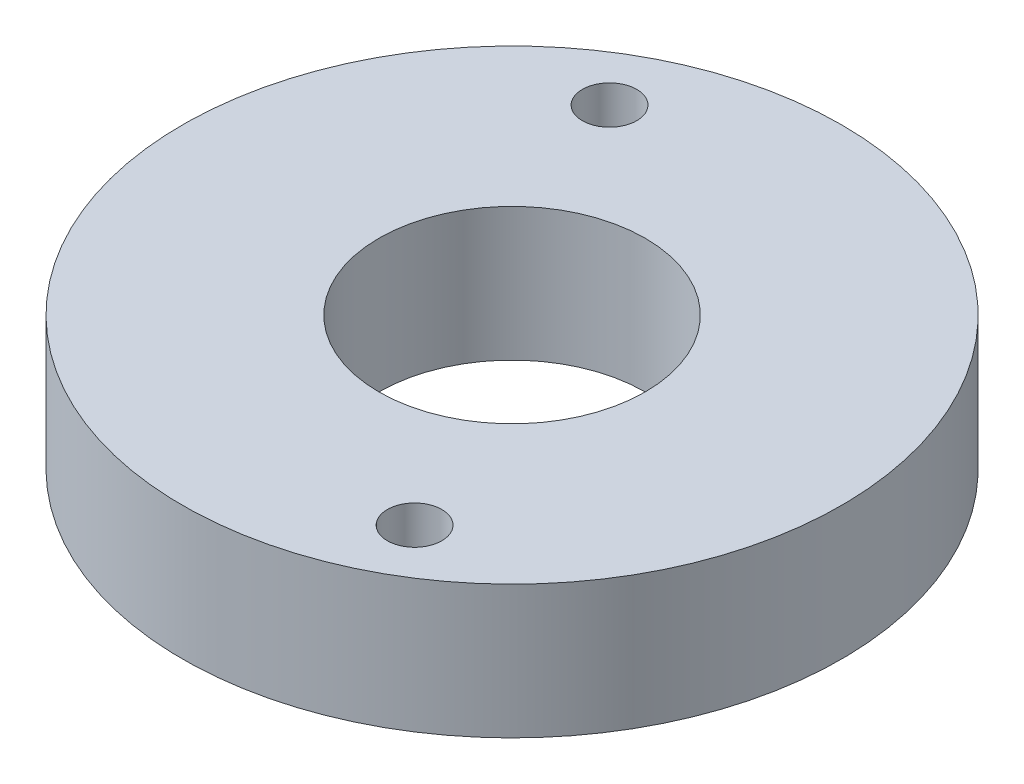
ISO-10303-21;
HEADER;
FILE_DESCRIPTION(('STEP AP214'),'2;1');
FILE_NAME('part.step','',(''),(''),'','','');
FILE_SCHEMA(('AUTOMOTIVE_DESIGN { 1 0 10303 214 1 1 1 1 }'));
ENDSEC;
DATA;
#1=APPLICATION_CONTEXT('core data for automotive mechanical design processes');
#2=APPLICATION_PROTOCOL_DEFINITION('international standard','automotive_design',2000,#1);
#3=PRODUCT_CONTEXT('',#1,'mechanical');
#4=PRODUCT('Part','Part','',(#3));
#5=PRODUCT_RELATED_PRODUCT_CATEGORY('part','',(#4));
#6=PRODUCT_DEFINITION_FORMATION('','',#4);
#7=PRODUCT_DEFINITION_CONTEXT('part definition',#1,'design');
#8=PRODUCT_DEFINITION('design','',#6,#7);
#9=PRODUCT_DEFINITION_SHAPE('','',#8);
#10=(LENGTH_UNIT() NAMED_UNIT(*) SI_UNIT(.MILLI.,.METRE.));
#11=(NAMED_UNIT(*) PLANE_ANGLE_UNIT() SI_UNIT($,.RADIAN.));
#12=(NAMED_UNIT(*) SI_UNIT($,.STERADIAN.) SOLID_ANGLE_UNIT());
#13=UNCERTAINTY_MEASURE_WITH_UNIT(LENGTH_MEASURE(1.E-05),#10,'distance_accuracy_value','');
#14=(GEOMETRIC_REPRESENTATION_CONTEXT(3) GLOBAL_UNCERTAINTY_ASSIGNED_CONTEXT((#13)) GLOBAL_UNIT_ASSIGNED_CONTEXT((#10,
#11,#12)) REPRESENTATION_CONTEXT('',''));
#15=CARTESIAN_POINT('',(0.,0.,0.));
#16=DIRECTION('',(0.,0.,1.));
#17=DIRECTION('',(1.,0.,0.));
#18=AXIS2_PLACEMENT_3D('',#15,#16,#17);
#19=CARTESIAN_POINT('',(15.24,0.,0.));
#20=CARTESIAN_POINT('',(26.4688604773883,6.79726570857821,0.));
#21=CARTESIAN_POINT('',(37.719,0.,0.));
#22=B_SPLINE_CURVE_WITH_KNOTS('',2,(#19,#20,#21),.UNSPECIFIED.,.F.,.F.,(3,3),(0.,1.),.UNSPECIFIED.);
#23=CARTESIAN_POINT('',(0.,0.,0.));
#24=DIRECTION('',(0.,-1.,0.));
#25=AXIS1_PLACEMENT('',#23,#24);
#26=SURFACE_OF_REVOLUTION('',#22,#25);
#27=CARTESIAN_POINT('',(0.,0.,0.));
#28=DIRECTION('',(0.,-1.,0.));
#29=DIRECTION('',(0.,0.,-1.));
#30=AXIS2_PLACEMENT_3D('',#27,#28,#29);
#31=CIRCLE('',#30,37.719);
#32=CARTESIAN_POINT('',(0.,0.,-37.719));
#33=VERTEX_POINT('',#32);
#34=EDGE_CURVE('E11',#33,#33,#31,.T.);
#35=ORIENTED_EDGE('',*,*,#34,.T.);
#36=EDGE_LOOP('',(#35));
#37=FACE_BOUND('',#36,.T.);
#38=CARTESIAN_POINT('',(0.,0.,0.));
#39=DIRECTION('',(0.,-1.,0.));
#40=DIRECTION('',(0.,0.,-1.));
#41=AXIS2_PLACEMENT_3D('',#38,#39,#40);
#42=CIRCLE('',#41,15.24);
#43=CARTESIAN_POINT('',(0.,0.,-15.24));
#44=VERTEX_POINT('',#43);
#45=EDGE_CURVE('E55',#44,#44,#42,.T.);
#46=ORIENTED_EDGE('',*,*,#45,.F.);
#47=EDGE_LOOP('',(#46));
#48=FACE_BOUND('',#47,.T.);
#49=ADVANCED_FACE('F40',(#37,#48),#26,.F.);
#50=CARTESIAN_POINT('',(0.,0.,0.));
#51=DIRECTION('',(0.,-1.,0.));
#52=DIRECTION('',(0.,0.,-1.));
#53=AXIS2_PLACEMENT_3D('',#50,#51,#52);
#54=CYLINDRICAL_SURFACE('',#53,37.719);
#55=CARTESIAN_POINT('',(0.,15.24,0.));
#56=DIRECTION('',(0.,-1.,0.));
#57=DIRECTION('',(0.,0.,-1.));
#58=AXIS2_PLACEMENT_3D('',#55,#56,#57);
#59=CIRCLE('',#58,37.719);
#60=CARTESIAN_POINT('',(0.,15.24,-37.719));
#61=VERTEX_POINT('',#60);
#62=EDGE_CURVE('E47',#61,#61,#59,.T.);
#63=ORIENTED_EDGE('',*,*,#62,.T.);
#64=EDGE_LOOP('',(#63));
#65=FACE_BOUND('',#64,.T.);
#66=ORIENTED_EDGE('',*,*,#34,.F.);
#67=EDGE_LOOP('',(#66));
#68=FACE_BOUND('',#67,.T.);
#69=ADVANCED_FACE('F86',(#65,#68),#54,.T.);
#70=CARTESIAN_POINT('',(37.719,15.24,0.));
#71=DIRECTION('',(0.,1.,0.));
#72=DIRECTION('',(0.,0.,1.));
#73=AXIS2_PLACEMENT_3D('',#70,#71,#72);
#74=PLANE('',#73);
#75=CARTESIAN_POINT('',(-15.2399999999998,15.24,-26.3964543073498));
#76=DIRECTION('',(0.,1.,0.));
#77=DIRECTION('',(0.,0.,1.));
#78=AXIS2_PLACEMENT_3D('',#75,#76,#77);
#79=CIRCLE('',#78,3.1115);
#80=CARTESIAN_POINT('',(-15.2399999999998,15.24,-23.2849543073498));
#81=VERTEX_POINT('',#80);
#82=EDGE_CURVE('E70',#81,#81,#79,.T.);
#83=ORIENTED_EDGE('',*,*,#82,.F.);
#84=EDGE_LOOP('',(#83));
#85=FACE_BOUND('',#84,.T.);
#86=CARTESIAN_POINT('',(15.2400000000002,15.24,26.3964543073496));
#87=DIRECTION('',(0.,1.,0.));
#88=DIRECTION('',(0.,0.,1.));
#89=AXIS2_PLACEMENT_3D('',#86,#87,#88);
#90=CIRCLE('',#89,3.1115);
#91=CARTESIAN_POINT('',(15.2400000000002,15.24,29.5079543073496));
#92=VERTEX_POINT('',#91);
#93=EDGE_CURVE('E64',#92,#92,#90,.T.);
#94=ORIENTED_EDGE('',*,*,#93,.F.);
#95=EDGE_LOOP('',(#94));
#96=FACE_BOUND('',#95,.T.);
#97=CARTESIAN_POINT('',(0.,15.24,0.));
#98=DIRECTION('',(0.,-1.,0.));
#99=DIRECTION('',(0.,0.,-1.));
#100=AXIS2_PLACEMENT_3D('',#97,#98,#99);
#101=CIRCLE('',#100,15.24);
#102=CARTESIAN_POINT('',(0.,15.24,-15.24));
#103=VERTEX_POINT('',#102);
#104=EDGE_CURVE('E51',#103,#103,#101,.T.);
#105=ORIENTED_EDGE('',*,*,#104,.T.);
#106=EDGE_LOOP('',(#105));
#107=FACE_BOUND('',#106,.T.);
#108=ORIENTED_EDGE('',*,*,#62,.F.);
#109=EDGE_LOOP('',(#108));
#110=FACE_BOUND('',#109,.T.);
#111=ADVANCED_FACE('F82',(#85,#96,#107,#110),#74,.T.);
#112=CARTESIAN_POINT('',(0.,0.,0.));
#113=DIRECTION('',(0.,-1.,0.));
#114=DIRECTION('',(0.,0.,-1.));
#115=AXIS2_PLACEMENT_3D('',#112,#113,#114);
#116=CYLINDRICAL_SURFACE('',#115,15.24);
#117=ORIENTED_EDGE('',*,*,#45,.T.);
#118=EDGE_LOOP('',(#117));
#119=FACE_BOUND('',#118,.T.);
#120=ORIENTED_EDGE('',*,*,#104,.F.);
#121=EDGE_LOOP('',(#120));
#122=FACE_BOUND('',#121,.T.);
#123=ADVANCED_FACE('F85',(#119,#122),#116,.F.);
#124=CARTESIAN_POINT('',(15.2400000000002,7.62,26.3964543073496));
#125=DIRECTION('',(0.,1.,0.));
#126=DIRECTION('',(0.,0.,1.));
#127=AXIS2_PLACEMENT_3D('',#124,#125,#126);
#128=CYLINDRICAL_SURFACE('',#127,3.1115);
#129=CARTESIAN_POINT('',(15.2400000000002,7.62,26.3964543073496));
#130=DIRECTION('',(0.,1.,0.));
#131=DIRECTION('',(0.,0.,1.));
#132=AXIS2_PLACEMENT_3D('',#129,#130,#131);
#133=CIRCLE('',#132,3.1115);
#134=CARTESIAN_POINT('',(15.2400000000002,7.62,29.5079543073496));
#135=VERTEX_POINT('',#134);
#136=EDGE_CURVE('E59',#135,#135,#133,.T.);
#137=CARTESIAN_POINT('',(15.2400000000002,7.62,29.5079543073496));
#138=CARTESIAN_POINT('',(15.2400000000002,7.699375,29.5079543073496));
#139=CARTESIAN_POINT('',(15.2400000000002,7.77875,29.5079543073496));
#140=CARTESIAN_POINT('',(15.2400000000002,7.9375,29.5079543073496));
#141=CARTESIAN_POINT('',(15.2400000000002,8.016875,29.5079543073496));
#142=CARTESIAN_POINT('',(15.2400000000002,8.175625,29.5079543073496));
#143=CARTESIAN_POINT('',(15.2400000000002,8.255,29.5079543073496));
#144=CARTESIAN_POINT('',(15.2400000000002,8.41375,29.5079543073496));
#145=CARTESIAN_POINT('',(15.2400000000002,8.493125,29.5079543073496));
#146=CARTESIAN_POINT('',(15.2400000000002,8.651875,29.5079543073496));
#147=CARTESIAN_POINT('',(15.2400000000002,8.73125,29.5079543073496));
#148=CARTESIAN_POINT('',(15.2400000000002,8.89,29.5079543073496));
#149=CARTESIAN_POINT('',(15.2400000000002,8.969375,29.5079543073496));
#150=CARTESIAN_POINT('',(15.2400000000002,9.128125,29.5079543073496));
#151=CARTESIAN_POINT('',(15.2400000000002,9.2075,29.5079543073496));
#152=CARTESIAN_POINT('',(15.2400000000002,9.36625,29.5079543073496));
#153=CARTESIAN_POINT('',(15.2400000000002,9.445625,29.5079543073496));
#154=CARTESIAN_POINT('',(15.2400000000002,9.604375,29.5079543073496));
#155=CARTESIAN_POINT('',(15.2400000000002,9.68375,29.5079543073496));
#156=CARTESIAN_POINT('',(15.2400000000002,9.8425,29.5079543073496));
#157=CARTESIAN_POINT('',(15.2400000000002,9.921875,29.5079543073496));
#158=CARTESIAN_POINT('',(15.2400000000002,10.080625,29.5079543073496));
#159=CARTESIAN_POINT('',(15.2400000000002,10.16,29.5079543073496));
#160=CARTESIAN_POINT('',(15.2400000000002,10.31875,29.5079543073496));
#161=CARTESIAN_POINT('',(15.2400000000002,10.398125,29.5079543073496));
#162=CARTESIAN_POINT('',(15.2400000000002,10.556875,29.5079543073496));
#163=CARTESIAN_POINT('',(15.2400000000002,10.63625,29.5079543073496));
#164=CARTESIAN_POINT('',(15.2400000000002,10.795,29.5079543073496));
#165=CARTESIAN_POINT('',(15.2400000000002,10.874375,29.5079543073496));
#166=CARTESIAN_POINT('',(15.2400000000002,11.033125,29.5079543073496));
#167=CARTESIAN_POINT('',(15.2400000000002,11.1125,29.5079543073496));
#168=CARTESIAN_POINT('',(15.2400000000002,11.27125,29.5079543073496));
#169=CARTESIAN_POINT('',(15.2400000000002,11.350625,29.5079543073496));
#170=CARTESIAN_POINT('',(15.2400000000002,11.509375,29.5079543073496));
#171=CARTESIAN_POINT('',(15.2400000000002,11.58875,29.5079543073496));
#172=CARTESIAN_POINT('',(15.2400000000002,11.7475,29.5079543073496));
#173=CARTESIAN_POINT('',(15.2400000000002,11.826875,29.5079543073496));
#174=CARTESIAN_POINT('',(15.2400000000002,11.985625,29.5079543073496));
#175=CARTESIAN_POINT('',(15.2400000000002,12.065,29.5079543073496));
#176=CARTESIAN_POINT('',(15.2400000000002,12.22375,29.5079543073496));
#177=CARTESIAN_POINT('',(15.2400000000002,12.303125,29.5079543073496));
#178=CARTESIAN_POINT('',(15.2400000000002,12.461875,29.5079543073496));
#179=CARTESIAN_POINT('',(15.2400000000002,12.54125,29.5079543073496));
#180=CARTESIAN_POINT('',(15.2400000000002,12.7,29.5079543073496));
#181=CARTESIAN_POINT('',(15.2400000000002,12.779375,29.5079543073496));
#182=CARTESIAN_POINT('',(15.2400000000002,12.938125,29.5079543073496));
#183=CARTESIAN_POINT('',(15.2400000000002,13.0175,29.5079543073496));
#184=CARTESIAN_POINT('',(15.2400000000002,13.17625,29.5079543073496));
#185=CARTESIAN_POINT('',(15.2400000000002,13.255625,29.5079543073496));
#186=CARTESIAN_POINT('',(15.2400000000002,13.414375,29.5079543073496));
#187=CARTESIAN_POINT('',(15.2400000000002,13.49375,29.5079543073496));
#188=CARTESIAN_POINT('',(15.2400000000002,13.6525,29.5079543073496));
#189=CARTESIAN_POINT('',(15.2400000000002,13.731875,29.5079543073496));
#190=CARTESIAN_POINT('',(15.2400000000002,13.890625,29.5079543073496));
#191=CARTESIAN_POINT('',(15.2400000000002,13.97,29.5079543073496));
#192=CARTESIAN_POINT('',(15.2400000000002,14.12875,29.5079543073496));
#193=CARTESIAN_POINT('',(15.2400000000002,14.208125,29.5079543073496));
#194=CARTESIAN_POINT('',(15.2400000000002,14.366875,29.5079543073496));
#195=CARTESIAN_POINT('',(15.2400000000002,14.44625,29.5079543073496));
#196=CARTESIAN_POINT('',(15.2400000000002,14.605,29.5079543073496));
#197=CARTESIAN_POINT('',(15.2400000000002,14.684375,29.5079543073496));
#198=CARTESIAN_POINT('',(15.2400000000002,14.843125,29.5079543073496));
#199=CARTESIAN_POINT('',(15.2400000000002,14.9225,29.5079543073496));
#200=CARTESIAN_POINT('',(15.2400000000002,15.08125,29.5079543073496));
#201=CARTESIAN_POINT('',(15.2400000000002,15.160625,29.5079543073496));
#202=CARTESIAN_POINT('',(15.2400000000002,15.24,29.5079543073496));
#203=B_SPLINE_CURVE_WITH_KNOTS('',3,(#137,#138,#139,#140,#141,#142,#143,#144,#145,#146,#147,
#148,#149,#150,#151,#152,#153,#154,#155,#156,#157,#158,#159,#160,#161,#162,#163,#164,#165,#166,
#167,#168,#169,#170,#171,#172,#173,#174,#175,#176,#177,#178,#179,#180,#181,#182,#183,#184,#185,
#186,#187,#188,#189,#190,#191,#192,#193,#194,#195,#196,#197,#198,#199,#200,#201,#202),
.UNSPECIFIED.,.F.,.F.,(4,2,2,2,2,2,2,2,2,2,2,2,2,2,2,2,2,2,2,2,2,2,2,2,2,2,2,2,2,2,2,2,4),(0.,
0.238125,0.47625,0.714374999999999,0.952499999999999,1.190625,1.42875,1.666875,1.905,2.143125,
2.38125,2.619375,2.8575,3.095625,3.33375,3.571875,3.81,4.048125,4.28625,4.524375,4.7625,
5.000625,5.23875,5.476875,5.715,5.953125,6.19125,6.429375,6.6675,6.905625,7.14375,7.381875,
7.62),.UNSPECIFIED.);
#204=EDGE_CURVE('BSEAM94',#135,#92,#203,.T.);
#205=ORIENTED_EDGE('',*,*,#136,.F.);
#206=ORIENTED_EDGE('',*,*,#93,.T.);
#207=ORIENTED_EDGE('',*,*,#204,.T.);
#208=ORIENTED_EDGE('',*,*,#204,.F.);
#209=EDGE_LOOP('',(#205,#207,#206,#208));
#210=FACE_BOUND('',#209,.T.);
#211=ADVANCED_FACE('F94',(#210),#128,.F.);
#212=CARTESIAN_POINT('',(0.,7.62,0.));
#213=DIRECTION('',(0.,1.,0.));
#214=DIRECTION('',(0.,0.,1.));
#215=AXIS2_PLACEMENT_3D('',#212,#213,#214);
#216=PLANE('',#215);
#217=ORIENTED_EDGE('',*,*,#136,.T.);
#218=EDGE_LOOP('',(#217));
#219=FACE_BOUND('',#218,.T.);
#220=ADVANCED_FACE('F100',(#219),#216,.T.);
#221=CARTESIAN_POINT('',(-15.2399999999998,7.62,-26.3964543073498));
#222=DIRECTION('',(0.,1.,0.));
#223=DIRECTION('',(0.,0.,1.));
#224=AXIS2_PLACEMENT_3D('',#221,#222,#223);
#225=CYLINDRICAL_SURFACE('',#224,3.1115);
#226=CARTESIAN_POINT('',(-15.2399999999998,7.62,-26.3964543073498));
#227=DIRECTION('',(0.,1.,0.));
#228=DIRECTION('',(0.,0.,1.));
#229=AXIS2_PLACEMENT_3D('',#226,#227,#228);
#230=CIRCLE('',#229,3.1115);
#231=CARTESIAN_POINT('',(-15.2399999999998,7.62,-23.2849543073498));
#232=VERTEX_POINT('',#231);
#233=EDGE_CURVE('E73',#232,#232,#230,.T.);
#234=CARTESIAN_POINT('',(-15.2399999999998,15.24,-23.2849543073498));
#235=CARTESIAN_POINT('',(-15.2399999999998,15.160625,-23.2849543073498));
#236=CARTESIAN_POINT('',(-15.2399999999998,15.08125,-23.2849543073498));
#237=CARTESIAN_POINT('',(-15.2399999999998,14.9225,-23.2849543073498));
#238=CARTESIAN_POINT('',(-15.2399999999998,14.843125,-23.2849543073498));
#239=CARTESIAN_POINT('',(-15.2399999999998,14.684375,-23.2849543073498));
#240=CARTESIAN_POINT('',(-15.2399999999998,14.605,-23.2849543073498));
#241=CARTESIAN_POINT('',(-15.2399999999998,14.44625,-23.2849543073498));
#242=CARTESIAN_POINT('',(-15.2399999999998,14.366875,-23.2849543073498));
#243=CARTESIAN_POINT('',(-15.2399999999998,14.208125,-23.2849543073498));
#244=CARTESIAN_POINT('',(-15.2399999999998,14.12875,-23.2849543073498));
#245=CARTESIAN_POINT('',(-15.2399999999998,13.97,-23.2849543073498));
#246=CARTESIAN_POINT('',(-15.2399999999998,13.890625,-23.2849543073498));
#247=CARTESIAN_POINT('',(-15.2399999999998,13.731875,-23.2849543073498));
#248=CARTESIAN_POINT('',(-15.2399999999998,13.6525,-23.2849543073498));
#249=CARTESIAN_POINT('',(-15.2399999999998,13.49375,-23.2849543073498));
#250=CARTESIAN_POINT('',(-15.2399999999998,13.414375,-23.2849543073498));
#251=CARTESIAN_POINT('',(-15.2399999999998,13.255625,-23.2849543073498));
#252=CARTESIAN_POINT('',(-15.2399999999998,13.17625,-23.2849543073498));
#253=CARTESIAN_POINT('',(-15.2399999999998,13.0175,-23.2849543073498));
#254=CARTESIAN_POINT('',(-15.2399999999998,12.938125,-23.2849543073498));
#255=CARTESIAN_POINT('',(-15.2399999999998,12.779375,-23.2849543073498));
#256=CARTESIAN_POINT('',(-15.2399999999998,12.7,-23.2849543073498));
#257=CARTESIAN_POINT('',(-15.2399999999998,12.54125,-23.2849543073498));
#258=CARTESIAN_POINT('',(-15.2399999999998,12.461875,-23.2849543073498));
#259=CARTESIAN_POINT('',(-15.2399999999998,12.303125,-23.2849543073498));
#260=CARTESIAN_POINT('',(-15.2399999999998,12.22375,-23.2849543073498));
#261=CARTESIAN_POINT('',(-15.2399999999998,12.065,-23.2849543073498));
#262=CARTESIAN_POINT('',(-15.2399999999998,11.985625,-23.2849543073498));
#263=CARTESIAN_POINT('',(-15.2399999999998,11.826875,-23.2849543073498));
#264=CARTESIAN_POINT('',(-15.2399999999998,11.7475,-23.2849543073498));
#265=CARTESIAN_POINT('',(-15.2399999999998,11.58875,-23.2849543073498));
#266=CARTESIAN_POINT('',(-15.2399999999998,11.509375,-23.2849543073498));
#267=CARTESIAN_POINT('',(-15.2399999999998,11.350625,-23.2849543073498));
#268=CARTESIAN_POINT('',(-15.2399999999998,11.27125,-23.2849543073498));
#269=CARTESIAN_POINT('',(-15.2399999999998,11.1125,-23.2849543073498));
#270=CARTESIAN_POINT('',(-15.2399999999998,11.033125,-23.2849543073498));
#271=CARTESIAN_POINT('',(-15.2399999999998,10.874375,-23.2849543073498));
#272=CARTESIAN_POINT('',(-15.2399999999998,10.795,-23.2849543073498));
#273=CARTESIAN_POINT('',(-15.2399999999998,10.63625,-23.2849543073498));
#274=CARTESIAN_POINT('',(-15.2399999999998,10.556875,-23.2849543073498));
#275=CARTESIAN_POINT('',(-15.2399999999998,10.398125,-23.2849543073498));
#276=CARTESIAN_POINT('',(-15.2399999999998,10.31875,-23.2849543073498));
#277=CARTESIAN_POINT('',(-15.2399999999998,10.16,-23.2849543073498));
#278=CARTESIAN_POINT('',(-15.2399999999998,10.080625,-23.2849543073498));
#279=CARTESIAN_POINT('',(-15.2399999999998,9.921875,-23.2849543073498));
#280=CARTESIAN_POINT('',(-15.2399999999998,9.8425,-23.2849543073498));
#281=CARTESIAN_POINT('',(-15.2399999999998,9.68375,-23.2849543073498));
#282=CARTESIAN_POINT('',(-15.2399999999998,9.604375,-23.2849543073498));
#283=CARTESIAN_POINT('',(-15.2399999999998,9.445625,-23.2849543073498));
#284=CARTESIAN_POINT('',(-15.2399999999998,9.36625,-23.2849543073498));
#285=CARTESIAN_POINT('',(-15.2399999999998,9.2075,-23.2849543073498));
#286=CARTESIAN_POINT('',(-15.2399999999998,9.128125,-23.2849543073498));
#287=CARTESIAN_POINT('',(-15.2399999999998,8.969375,-23.2849543073498));
#288=CARTESIAN_POINT('',(-15.2399999999998,8.89,-23.2849543073498));
#289=CARTESIAN_POINT('',(-15.2399999999998,8.73125,-23.2849543073498));
#290=CARTESIAN_POINT('',(-15.2399999999998,8.651875,-23.2849543073498));
#291=CARTESIAN_POINT('',(-15.2399999999998,8.493125,-23.2849543073498));
#292=CARTESIAN_POINT('',(-15.2399999999998,8.41375,-23.2849543073498));
#293=CARTESIAN_POINT('',(-15.2399999999998,8.255,-23.2849543073498));
#294=CARTESIAN_POINT('',(-15.2399999999998,8.175625,-23.2849543073498));
#295=CARTESIAN_POINT('',(-15.2399999999998,8.016875,-23.2849543073498));
#296=CARTESIAN_POINT('',(-15.2399999999998,7.9375,-23.2849543073498));
#297=CARTESIAN_POINT('',(-15.2399999999998,7.77875,-23.2849543073498));
#298=CARTESIAN_POINT('',(-15.2399999999998,7.699375,-23.2849543073498));
#299=CARTESIAN_POINT('',(-15.2399999999998,7.62,-23.2849543073498));
#300=B_SPLINE_CURVE_WITH_KNOTS('',3,(#234,#235,#236,#237,#238,#239,#240,#241,#242,#243,#244,
#245,#246,#247,#248,#249,#250,#251,#252,#253,#254,#255,#256,#257,#258,#259,#260,#261,#262,#263,
#264,#265,#266,#267,#268,#269,#270,#271,#272,#273,#274,#275,#276,#277,#278,#279,#280,#281,#282,
#283,#284,#285,#286,#287,#288,#289,#290,#291,#292,#293,#294,#295,#296,#297,#298,#299),
.UNSPECIFIED.,.F.,.F.,(4,2,2,2,2,2,2,2,2,2,2,2,2,2,2,2,2,2,2,2,2,2,2,2,2,2,2,2,2,2,2,2,4),(0.,
0.238125,0.476249999999999,0.714375,0.9525,1.190625,1.42875,1.666875,1.905,2.143125,2.38125,
2.619375,2.8575,3.095625,3.33375,3.571875,3.81,4.048125,4.28625,4.524375,4.7625,5.000625,
5.23875,5.476875,5.715,5.953125,6.19125,6.429375,6.6675,6.905625,7.14375,7.381875,7.62),.UNSPECIFIED.);
#301=EDGE_CURVE('BSEAM79',#81,#232,#300,.T.);
#302=ORIENTED_EDGE('',*,*,#82,.T.);
#303=ORIENTED_EDGE('',*,*,#233,.F.);
#304=ORIENTED_EDGE('',*,*,#301,.T.);
#305=ORIENTED_EDGE('',*,*,#301,.F.);
#306=EDGE_LOOP('',(#302,#304,#303,#305));
#307=FACE_BOUND('',#306,.T.);
#308=ADVANCED_FACE('F79',(#307),#225,.F.);
#309=CARTESIAN_POINT('',(0.,7.62,0.));
#310=DIRECTION('',(0.,1.,0.));
#311=DIRECTION('',(0.,0.,1.));
#312=AXIS2_PLACEMENT_3D('',#309,#310,#311);
#313=PLANE('',#312);
#314=ORIENTED_EDGE('',*,*,#233,.T.);
#315=EDGE_LOOP('',(#314));
#316=FACE_BOUND('',#315,.T.);
#317=ADVANCED_FACE('F144',(#316),#313,.T.);
#318=CLOSED_SHELL('',(#49,#69,#111,#123,#211,#220,#308,#317));
#319=MANIFOLD_SOLID_BREP('B2',#318);
#320=ADVANCED_BREP_SHAPE_REPRESENTATION('',(#18,#319),#14);
#321=SHAPE_DEFINITION_REPRESENTATION(#9,#320);
ENDSEC;
END-ISO-10303-21;
